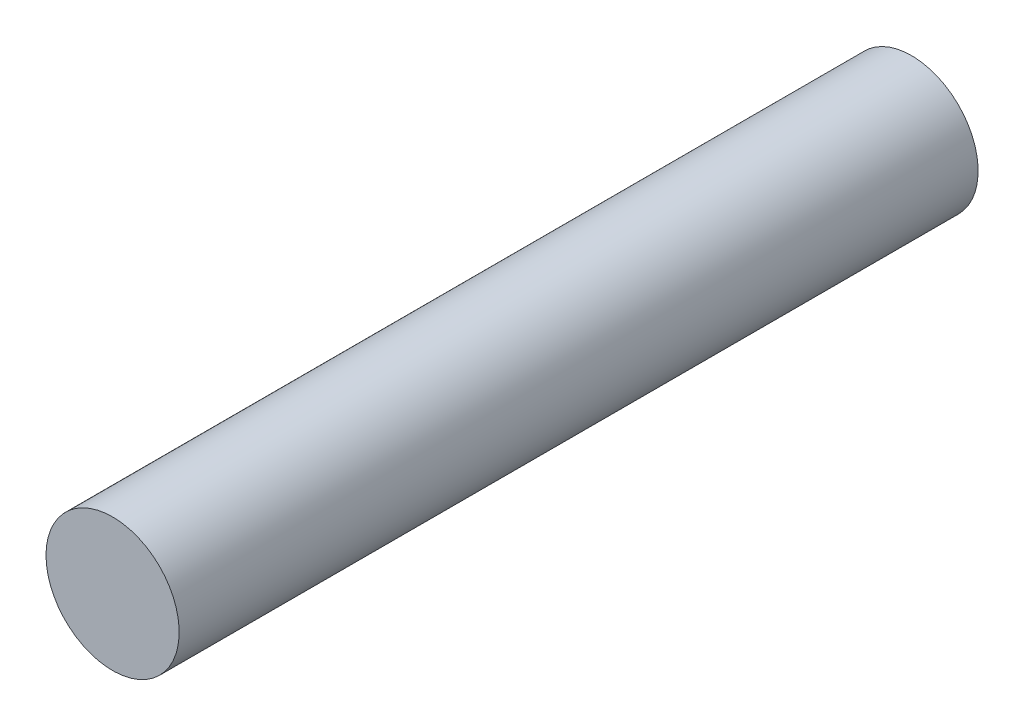
ISO-10303-21;
HEADER;
FILE_DESCRIPTION(('STEP AP214'),'2;1');
FILE_NAME('part.step','',(''),(''),'','','');
FILE_SCHEMA(('AUTOMOTIVE_DESIGN { 1 0 10303 214 1 1 1 1 }'));
ENDSEC;
DATA;
#1=APPLICATION_CONTEXT('core data for automotive mechanical design processes');
#2=APPLICATION_PROTOCOL_DEFINITION('international standard','automotive_design',2000,#1);
#3=PRODUCT_CONTEXT('',#1,'mechanical');
#4=PRODUCT('Part','Part','',(#3));
#5=PRODUCT_RELATED_PRODUCT_CATEGORY('part','',(#4));
#6=PRODUCT_DEFINITION_FORMATION('','',#4);
#7=PRODUCT_DEFINITION_CONTEXT('part definition',#1,'design');
#8=PRODUCT_DEFINITION('design','',#6,#7);
#9=PRODUCT_DEFINITION_SHAPE('','',#8);
#10=(LENGTH_UNIT() NAMED_UNIT(*) SI_UNIT(.MILLI.,.METRE.));
#11=(NAMED_UNIT(*) PLANE_ANGLE_UNIT() SI_UNIT($,.RADIAN.));
#12=(NAMED_UNIT(*) SI_UNIT($,.STERADIAN.) SOLID_ANGLE_UNIT());
#13=UNCERTAINTY_MEASURE_WITH_UNIT(LENGTH_MEASURE(1.E-05),#10,'distance_accuracy_value','');
#14=(GEOMETRIC_REPRESENTATION_CONTEXT(3) GLOBAL_UNCERTAINTY_ASSIGNED_CONTEXT((#13)) GLOBAL_UNIT_ASSIGNED_CONTEXT((#10,
#11,#12)) REPRESENTATION_CONTEXT('',''));
#15=CARTESIAN_POINT('',(0.,0.,0.));
#16=DIRECTION('',(0.,0.,1.));
#17=DIRECTION('',(1.,0.,0.));
#18=AXIS2_PLACEMENT_3D('',#15,#16,#17);
#19=CARTESIAN_POINT('',(0.,0.,38.1));
#20=DIRECTION('',(0.,0.,-1.));
#21=DIRECTION('',(-1.,0.,0.));
#22=AXIS2_PLACEMENT_3D('',#19,#20,#21);
#23=CYLINDRICAL_SURFACE('',#22,3.175);
#24=CARTESIAN_POINT('',(0.,0.,38.1));
#25=DIRECTION('',(0.,0.,1.));
#26=DIRECTION('',(1.,0.,0.));
#27=AXIS2_PLACEMENT_3D('',#24,#25,#26);
#28=CIRCLE('',#27,3.175);
#29=CARTESIAN_POINT('',(-3.175,0.,38.1));
#30=VERTEX_POINT('',#29);
#31=EDGE_CURVE('E10',#30,#30,#28,.T.);
#32=CARTESIAN_POINT('',(0.,0.,0.));
#33=DIRECTION('',(0.,0.,1.));
#34=DIRECTION('',(1.,0.,0.));
#35=AXIS2_PLACEMENT_3D('',#32,#33,#34);
#36=CIRCLE('',#35,3.175);
#37=CARTESIAN_POINT('',(-3.175,0.,0.));
#38=VERTEX_POINT('',#37);
#39=EDGE_CURVE('E34',#38,#38,#36,.T.);
#40=CARTESIAN_POINT('',(-3.175,0.,38.1));
#41=CARTESIAN_POINT('',(-3.175,0.,37.703125));
#42=CARTESIAN_POINT('',(-3.175,0.,37.30625));
#43=CARTESIAN_POINT('',(-3.175,0.,36.5125));
#44=CARTESIAN_POINT('',(-3.175,0.,36.115625));
#45=CARTESIAN_POINT('',(-3.175,0.,35.321875));
#46=CARTESIAN_POINT('',(-3.175,0.,34.925));
#47=CARTESIAN_POINT('',(-3.175,0.,34.13125));
#48=CARTESIAN_POINT('',(-3.175,0.,33.734375));
#49=CARTESIAN_POINT('',(-3.175,0.,32.940625));
#50=CARTESIAN_POINT('',(-3.175,0.,32.54375));
#51=CARTESIAN_POINT('',(-3.175,0.,31.75));
#52=CARTESIAN_POINT('',(-3.175,0.,31.353125));
#53=CARTESIAN_POINT('',(-3.175,0.,30.559375));
#54=CARTESIAN_POINT('',(-3.175,0.,30.1625));
#55=CARTESIAN_POINT('',(-3.175,0.,29.36875));
#56=CARTESIAN_POINT('',(-3.175,0.,28.971875));
#57=CARTESIAN_POINT('',(-3.175,0.,28.178125));
#58=CARTESIAN_POINT('',(-3.175,0.,27.78125));
#59=CARTESIAN_POINT('',(-3.175,0.,26.9875));
#60=CARTESIAN_POINT('',(-3.175,0.,26.590625));
#61=CARTESIAN_POINT('',(-3.175,0.,25.796875));
#62=CARTESIAN_POINT('',(-3.175,0.,25.4));
#63=CARTESIAN_POINT('',(-3.175,0.,24.60625));
#64=CARTESIAN_POINT('',(-3.175,0.,24.209375));
#65=CARTESIAN_POINT('',(-3.175,0.,23.415625));
#66=CARTESIAN_POINT('',(-3.175,0.,23.01875));
#67=CARTESIAN_POINT('',(-3.175,0.,22.225));
#68=CARTESIAN_POINT('',(-3.175,0.,21.828125));
#69=CARTESIAN_POINT('',(-3.175,0.,21.034375));
#70=CARTESIAN_POINT('',(-3.175,0.,20.6375));
#71=CARTESIAN_POINT('',(-3.175,0.,19.84375));
#72=CARTESIAN_POINT('',(-3.175,0.,19.446875));
#73=CARTESIAN_POINT('',(-3.175,0.,18.653125));
#74=CARTESIAN_POINT('',(-3.175,0.,18.25625));
#75=CARTESIAN_POINT('',(-3.175,0.,17.4625));
#76=CARTESIAN_POINT('',(-3.175,0.,17.065625));
#77=CARTESIAN_POINT('',(-3.175,0.,16.271875));
#78=CARTESIAN_POINT('',(-3.175,0.,15.875));
#79=CARTESIAN_POINT('',(-3.175,0.,15.08125));
#80=CARTESIAN_POINT('',(-3.175,0.,14.684375));
#81=CARTESIAN_POINT('',(-3.175,0.,13.890625));
#82=CARTESIAN_POINT('',(-3.175,0.,13.49375));
#83=CARTESIAN_POINT('',(-3.175,0.,12.7));
#84=CARTESIAN_POINT('',(-3.175,0.,12.303125));
#85=CARTESIAN_POINT('',(-3.175,0.,11.509375));
#86=CARTESIAN_POINT('',(-3.175,0.,11.1125));
#87=CARTESIAN_POINT('',(-3.175,0.,10.31875));
#88=CARTESIAN_POINT('',(-3.175,0.,9.921875));
#89=CARTESIAN_POINT('',(-3.175,0.,9.128125));
#90=CARTESIAN_POINT('',(-3.175,0.,8.73125));
#91=CARTESIAN_POINT('',(-3.175,0.,7.9375));
#92=CARTESIAN_POINT('',(-3.175,0.,7.540625));
#93=CARTESIAN_POINT('',(-3.175,0.,6.746875));
#94=CARTESIAN_POINT('',(-3.175,0.,6.35));
#95=CARTESIAN_POINT('',(-3.175,0.,5.55625));
#96=CARTESIAN_POINT('',(-3.175,0.,5.159375));
#97=CARTESIAN_POINT('',(-3.175,0.,4.365625));
#98=CARTESIAN_POINT('',(-3.175,0.,3.96875));
#99=CARTESIAN_POINT('',(-3.175,0.,3.175));
#100=CARTESIAN_POINT('',(-3.175,0.,2.778125));
#101=CARTESIAN_POINT('',(-3.175,0.,1.984375));
#102=CARTESIAN_POINT('',(-3.175,0.,1.5875));
#103=CARTESIAN_POINT('',(-3.175,0.,0.79375));
#104=CARTESIAN_POINT('',(-3.175,0.,0.396875));
#105=CARTESIAN_POINT('',(-3.175,0.,0.));
#106=B_SPLINE_CURVE_WITH_KNOTS('',3,(#40,#41,#42,#43,#44,#45,#46,#47,#48,#49,#50,#51,#52,#53,
#54,#55,#56,#57,#58,#59,#60,#61,#62,#63,#64,#65,#66,#67,#68,#69,#70,#71,#72,#73,#74,#75,#76,#77,
#78,#79,#80,#81,#82,#83,#84,#85,#86,#87,#88,#89,#90,#91,#92,#93,#94,#95,#96,#97,#98,#99,#100,
#101,#102,#103,#104,#105),.UNSPECIFIED.,.F.,.F.,(4,2,2,2,2,2,2,2,2,2,2,2,2,2,2,2,2,2,2,2,2,2,2,
2,2,2,2,2,2,2,2,2,4),(0.,1.19062499999999,2.38124999999999,3.571875,4.7625,5.953125,7.14375,
8.33437499999999,9.525,10.715625,11.90625,13.096875,14.2875,15.478125,16.66875,17.859375,19.05,
20.240625,21.43125,22.621875,23.8125,25.003125,26.19375,27.384375,28.575,29.765625,30.95625,
32.146875,33.3375,34.528125,35.71875,36.909375,38.1),.UNSPECIFIED.);
#107=EDGE_CURVE('BSEAM31',#30,#38,#106,.T.);
#108=ORIENTED_EDGE('',*,*,#31,.F.);
#109=ORIENTED_EDGE('',*,*,#39,.T.);
#110=ORIENTED_EDGE('',*,*,#107,.T.);
#111=ORIENTED_EDGE('',*,*,#107,.F.);
#112=EDGE_LOOP('',(#108,#110,#109,#111));
#113=FACE_BOUND('',#112,.T.);
#114=ADVANCED_FACE('F31',(#113),#23,.T.);
#115=CARTESIAN_POINT('',(0.,0.,38.1));
#116=DIRECTION('',(0.,0.,1.));
#117=DIRECTION('',(1.,0.,0.));
#118=AXIS2_PLACEMENT_3D('',#115,#116,#117);
#119=PLANE('',#118);
#120=ORIENTED_EDGE('',*,*,#31,.T.);
#121=EDGE_LOOP('',(#120));
#122=FACE_BOUND('',#121,.T.);
#123=ADVANCED_FACE('F46',(#122),#119,.T.);
#124=CARTESIAN_POINT('',(0.,0.,0.));
#125=DIRECTION('',(0.,0.,1.));
#126=DIRECTION('',(1.,0.,0.));
#127=AXIS2_PLACEMENT_3D('',#124,#125,#126);
#128=PLANE('',#127);
#129=ORIENTED_EDGE('',*,*,#39,.F.);
#130=EDGE_LOOP('',(#129));
#131=FACE_BOUND('',#130,.T.);
#132=ADVANCED_FACE('F44',(#131),#128,.F.);
#133=CLOSED_SHELL('',(#114,#123,#132));
#134=MANIFOLD_SOLID_BREP('B2',#133);
#135=ADVANCED_BREP_SHAPE_REPRESENTATION('',(#18,#134),#14);
#136=SHAPE_DEFINITION_REPRESENTATION(#9,#135);
ENDSEC;
END-ISO-10303-21;
